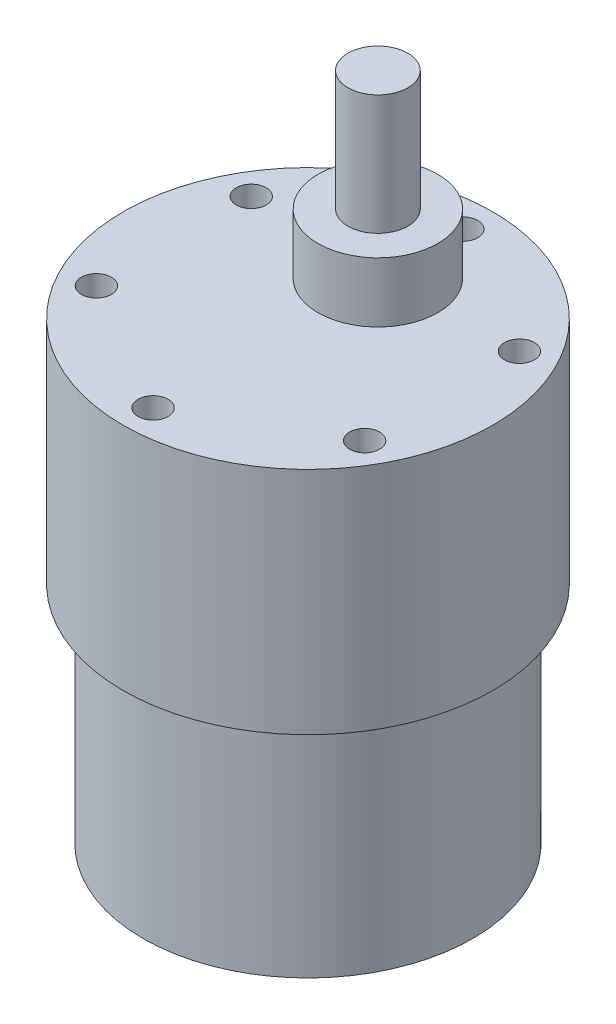
ISO-10303-21;
HEADER;
FILE_DESCRIPTION(('STEP AP214'),'2;1');
FILE_NAME('part.step','',(''),(''),'','','');
FILE_SCHEMA(('AUTOMOTIVE_DESIGN { 1 0 10303 214 1 1 1 1 }'));
ENDSEC;
DATA;
#1=APPLICATION_CONTEXT('core data for automotive mechanical design processes');
#2=APPLICATION_PROTOCOL_DEFINITION('international standard','automotive_design',2000,#1);
#3=PRODUCT_CONTEXT('',#1,'mechanical');
#4=PRODUCT('Part','Part','',(#3));
#5=PRODUCT_RELATED_PRODUCT_CATEGORY('part','',(#4));
#6=PRODUCT_DEFINITION_FORMATION('','',#4);
#7=PRODUCT_DEFINITION_CONTEXT('part definition',#1,'design');
#8=PRODUCT_DEFINITION('design','',#6,#7);
#9=PRODUCT_DEFINITION_SHAPE('','',#8);
#10=(LENGTH_UNIT() NAMED_UNIT(*) SI_UNIT(.MILLI.,.METRE.));
#11=(NAMED_UNIT(*) PLANE_ANGLE_UNIT() SI_UNIT($,.RADIAN.));
#12=(NAMED_UNIT(*) SI_UNIT($,.STERADIAN.) SOLID_ANGLE_UNIT());
#13=UNCERTAINTY_MEASURE_WITH_UNIT(LENGTH_MEASURE(1.E-05),#10,'distance_accuracy_value','');
#14=(GEOMETRIC_REPRESENTATION_CONTEXT(3) GLOBAL_UNCERTAINTY_ASSIGNED_CONTEXT((#13)) GLOBAL_UNIT_ASSIGNED_CONTEXT((#10,
#11,#12)) REPRESENTATION_CONTEXT('',''));
#15=CARTESIAN_POINT('',(0.,0.,0.));
#16=DIRECTION('',(0.,0.,1.));
#17=DIRECTION('',(1.,0.,0.));
#18=AXIS2_PLACEMENT_3D('',#15,#16,#17);
#19=CARTESIAN_POINT('',(0.,-23.,0.));
#20=DIRECTION('',(0.,1.,0.));
#21=DIRECTION('',(0.,0.,1.));
#22=AXIS2_PLACEMENT_3D('',#19,#20,#21);
#23=CYLINDRICAL_SURFACE('',#22,18.5);
#24=CARTESIAN_POINT('',(0.,-23.,0.));
#25=DIRECTION('',(0.,1.,0.));
#26=DIRECTION('',(0.,0.,1.));
#27=AXIS2_PLACEMENT_3D('',#24,#25,#26);
#28=CIRCLE('',#27,18.5);
#29=CARTESIAN_POINT('',(0.,-23.,18.5));
#30=VERTEX_POINT('',#29);
#31=EDGE_CURVE('E45',#30,#30,#28,.T.);
#32=ORIENTED_EDGE('',*,*,#31,.T.);
#33=EDGE_LOOP('',(#32));
#34=FACE_BOUND('',#33,.T.);
#35=CARTESIAN_POINT('',(0.,0.,0.));
#36=DIRECTION('',(0.,1.,0.));
#37=DIRECTION('',(0.,0.,1.));
#38=AXIS2_PLACEMENT_3D('',#35,#36,#37);
#39=CIRCLE('',#38,18.5);
#40=CARTESIAN_POINT('',(0.,0.,18.5));
#41=VERTEX_POINT('',#40);
#42=EDGE_CURVE('E36',#41,#41,#39,.T.);
#43=ORIENTED_EDGE('',*,*,#42,.F.);
#44=EDGE_LOOP('',(#43));
#45=FACE_BOUND('',#44,.T.);
#46=ADVANCED_FACE('F33',(#34,#45),#23,.T.);
#47=CARTESIAN_POINT('',(0.,-23.,0.));
#48=DIRECTION('',(0.,1.,0.));
#49=DIRECTION('',(0.,0.,1.));
#50=AXIS2_PLACEMENT_3D('',#47,#48,#49);
#51=PLANE('',#50);
#52=CARTESIAN_POINT('',(0.,-23.,0.));
#53=DIRECTION('',(0.,-1.,0.));
#54=DIRECTION('',(0.,0.,-1.));
#55=AXIS2_PLACEMENT_3D('',#52,#53,#54);
#56=CIRCLE('',#55,16.5);
#57=CARTESIAN_POINT('',(0.,-23.,16.5));
#58=VERTEX_POINT('',#57);
#59=EDGE_CURVE('E40',#58,#58,#56,.T.);
#60=ORIENTED_EDGE('',*,*,#59,.F.);
#61=EDGE_LOOP('',(#60));
#62=FACE_BOUND('',#61,.T.);
#63=ORIENTED_EDGE('',*,*,#31,.F.);
#64=EDGE_LOOP('',(#63));
#65=FACE_BOUND('',#64,.T.);
#66=ADVANCED_FACE('F103',(#62,#65),#51,.F.);
#67=CARTESIAN_POINT('',(0.,0.,0.));
#68=DIRECTION('',(0.,1.,0.));
#69=DIRECTION('',(0.,0.,1.));
#70=AXIS2_PLACEMENT_3D('',#67,#68,#69);
#71=PLANE('',#70);
#72=CARTESIAN_POINT('',(0.,0.,-7.));
#73=DIRECTION('',(0.,1.,0.));
#74=DIRECTION('',(0.,0.,1.));
#75=AXIS2_PLACEMENT_3D('',#72,#73,#74);
#76=CIRCLE('',#75,6.);
#77=CARTESIAN_POINT('',(0.,0.,-0.999999999999999));
#78=VERTEX_POINT('',#77);
#79=EDGE_CURVE('E54',#78,#78,#76,.T.);
#80=ORIENTED_EDGE('',*,*,#79,.F.);
#81=EDGE_LOOP('',(#80));
#82=FACE_BOUND('',#81,.T.);
#83=CARTESIAN_POINT('',(0.,0.,-15.5));
#84=DIRECTION('',(0.,1.,0.));
#85=DIRECTION('',(0.,0.,1.));
#86=AXIS2_PLACEMENT_3D('',#83,#84,#85);
#87=CIRCLE('',#86,1.5);
#88=CARTESIAN_POINT('',(0.,0.,-14.));
#89=VERTEX_POINT('',#88);
#90=EDGE_CURVE('E61',#89,#89,#87,.T.);
#91=ORIENTED_EDGE('',*,*,#90,.F.);
#92=EDGE_LOOP('',(#91));
#93=FACE_BOUND('',#92,.T.);
#94=CARTESIAN_POINT('',(-13.4233937586585,0.,-7.74999999999942));
#95=DIRECTION('',(0.,1.,0.));
#96=DIRECTION('',(0.,0.,1.));
#97=AXIS2_PLACEMENT_3D('',#94,#95,#96);
#98=CIRCLE('',#97,1.50000000000067);
#99=CARTESIAN_POINT('',(-13.4233937586585,0.,-6.24999999999875));
#100=VERTEX_POINT('',#99);
#101=EDGE_CURVE('E53',#100,#100,#98,.T.);
#102=ORIENTED_EDGE('',*,*,#101,.F.);
#103=EDGE_LOOP('',(#102));
#104=FACE_BOUND('',#103,.T.);
#105=CARTESIAN_POINT('',(-13.4233937586578,0.,7.75000000000058));
#106=DIRECTION('',(0.,1.,0.));
#107=DIRECTION('',(0.,0.,1.));
#108=AXIS2_PLACEMENT_3D('',#105,#106,#107);
#109=CIRCLE('',#108,1.50000000000126);
#110=CARTESIAN_POINT('',(-13.4233937586578,0.,9.25000000000183));
#111=VERTEX_POINT('',#110);
#112=EDGE_CURVE('E68',#111,#111,#109,.T.);
#113=ORIENTED_EDGE('',*,*,#112,.F.);
#114=EDGE_LOOP('',(#113));
#115=FACE_BOUND('',#114,.T.);
#116=CARTESIAN_POINT('',(1.31781308343643E-12,0.,15.5));
#117=DIRECTION('',(0.,1.,0.));
#118=DIRECTION('',(0.,0.,1.));
#119=AXIS2_PLACEMENT_3D('',#116,#117,#118);
#120=CIRCLE('',#119,1.50000000000136);
#121=CARTESIAN_POINT('',(1.31781308343643E-12,0.,17.0000000000014));
#122=VERTEX_POINT('',#121);
#123=EDGE_CURVE('E85',#122,#122,#120,.T.);
#124=ORIENTED_EDGE('',*,*,#123,.F.);
#125=EDGE_LOOP('',(#124));
#126=FACE_BOUND('',#125,.T.);
#127=CARTESIAN_POINT('',(13.4233937586598,0.,7.74999999999943));
#128=DIRECTION('',(0.,1.,0.));
#129=DIRECTION('',(0.,0.,1.));
#130=AXIS2_PLACEMENT_3D('',#127,#128,#129);
#131=CIRCLE('',#130,1.50000000000085);
#132=CARTESIAN_POINT('',(13.4233937586598,0.,9.25000000000028));
#133=VERTEX_POINT('',#132);
#134=EDGE_CURVE('E79',#133,#133,#131,.T.);
#135=ORIENTED_EDGE('',*,*,#134,.F.);
#136=EDGE_LOOP('',(#135));
#137=FACE_BOUND('',#136,.T.);
#138=CARTESIAN_POINT('',(13.4233937586591,0.,-7.75000000000057));
#139=DIRECTION('',(0.,1.,0.));
#140=DIRECTION('',(0.,0.,1.));
#141=AXIS2_PLACEMENT_3D('',#138,#139,#140);
#142=CIRCLE('',#141,1.50000000000019);
#143=CARTESIAN_POINT('',(13.4233937586591,0.,-6.25000000000039));
#144=VERTEX_POINT('',#143);
#145=EDGE_CURVE('E73',#144,#144,#142,.T.);
#146=ORIENTED_EDGE('',*,*,#145,.F.);
#147=EDGE_LOOP('',(#146));
#148=FACE_BOUND('',#147,.T.);
#149=ORIENTED_EDGE('',*,*,#42,.T.);
#150=EDGE_LOOP('',(#149));
#151=FACE_BOUND('',#150,.T.);
#152=ADVANCED_FACE('F100',(#82,#93,#104,#115,#126,#137,#148,#151),#71,.T.);
#153=CARTESIAN_POINT('',(0.,-45.5,0.));
#154=DIRECTION('',(0.,1.,0.));
#155=DIRECTION('',(0.,0.,1.));
#156=AXIS2_PLACEMENT_3D('',#153,#154,#155);
#157=CYLINDRICAL_SURFACE('',#156,16.5);
#158=CARTESIAN_POINT('',(0.,-45.5,0.));
#159=DIRECTION('',(0.,-1.,0.));
#160=DIRECTION('',(0.,0.,-1.));
#161=AXIS2_PLACEMENT_3D('',#158,#159,#160);
#162=CIRCLE('',#161,16.5);
#163=CARTESIAN_POINT('',(0.,-45.5,16.5));
#164=VERTEX_POINT('',#163);
#165=EDGE_CURVE('E60',#164,#164,#162,.T.);
#166=CARTESIAN_POINT('',(0.,-45.5,16.5));
#167=CARTESIAN_POINT('',(0.,-45.265625,16.5));
#168=CARTESIAN_POINT('',(0.,-45.03125,16.5));
#169=CARTESIAN_POINT('',(0.,-44.5625,16.5));
#170=CARTESIAN_POINT('',(0.,-44.328125,16.5));
#171=CARTESIAN_POINT('',(0.,-43.859375,16.5));
#172=CARTESIAN_POINT('',(0.,-43.625,16.5));
#173=CARTESIAN_POINT('',(0.,-43.15625,16.5));
#174=CARTESIAN_POINT('',(0.,-42.921875,16.5));
#175=CARTESIAN_POINT('',(0.,-42.453125,16.5));
#176=CARTESIAN_POINT('',(0.,-42.21875,16.5));
#177=CARTESIAN_POINT('',(0.,-41.75,16.5));
#178=CARTESIAN_POINT('',(0.,-41.515625,16.5));
#179=CARTESIAN_POINT('',(0.,-41.046875,16.5));
#180=CARTESIAN_POINT('',(0.,-40.8125,16.5));
#181=CARTESIAN_POINT('',(0.,-40.34375,16.5));
#182=CARTESIAN_POINT('',(0.,-40.109375,16.5));
#183=CARTESIAN_POINT('',(0.,-39.640625,16.5));
#184=CARTESIAN_POINT('',(0.,-39.40625,16.5));
#185=CARTESIAN_POINT('',(0.,-38.9375,16.5));
#186=CARTESIAN_POINT('',(0.,-38.703125,16.5));
#187=CARTESIAN_POINT('',(0.,-38.234375,16.5));
#188=CARTESIAN_POINT('',(0.,-38.,16.5));
#189=CARTESIAN_POINT('',(0.,-37.53125,16.5));
#190=CARTESIAN_POINT('',(0.,-37.296875,16.5));
#191=CARTESIAN_POINT('',(0.,-36.828125,16.5));
#192=CARTESIAN_POINT('',(0.,-36.59375,16.5));
#193=CARTESIAN_POINT('',(0.,-36.125,16.5));
#194=CARTESIAN_POINT('',(0.,-35.890625,16.5));
#195=CARTESIAN_POINT('',(0.,-35.421875,16.5));
#196=CARTESIAN_POINT('',(0.,-35.1875,16.5));
#197=CARTESIAN_POINT('',(0.,-34.71875,16.5));
#198=CARTESIAN_POINT('',(0.,-34.484375,16.5));
#199=CARTESIAN_POINT('',(0.,-34.015625,16.5));
#200=CARTESIAN_POINT('',(0.,-33.78125,16.5));
#201=CARTESIAN_POINT('',(0.,-33.3125,16.5));
#202=CARTESIAN_POINT('',(0.,-33.078125,16.5));
#203=CARTESIAN_POINT('',(0.,-32.609375,16.5));
#204=CARTESIAN_POINT('',(0.,-32.375,16.5));
#205=CARTESIAN_POINT('',(0.,-31.90625,16.5));
#206=CARTESIAN_POINT('',(0.,-31.671875,16.5));
#207=CARTESIAN_POINT('',(0.,-31.203125,16.5));
#208=CARTESIAN_POINT('',(0.,-30.96875,16.5));
#209=CARTESIAN_POINT('',(0.,-30.5,16.5));
#210=CARTESIAN_POINT('',(0.,-30.265625,16.5));
#211=CARTESIAN_POINT('',(0.,-29.796875,16.5));
#212=CARTESIAN_POINT('',(0.,-29.5625,16.5));
#213=CARTESIAN_POINT('',(0.,-29.09375,16.5));
#214=CARTESIAN_POINT('',(0.,-28.859375,16.5));
#215=CARTESIAN_POINT('',(0.,-28.390625,16.5));
#216=CARTESIAN_POINT('',(0.,-28.15625,16.5));
#217=CARTESIAN_POINT('',(0.,-27.6875,16.5));
#218=CARTESIAN_POINT('',(0.,-27.453125,16.5));
#219=CARTESIAN_POINT('',(0.,-26.984375,16.5));
#220=CARTESIAN_POINT('',(0.,-26.75,16.5));
#221=CARTESIAN_POINT('',(0.,-26.28125,16.5));
#222=CARTESIAN_POINT('',(0.,-26.046875,16.5));
#223=CARTESIAN_POINT('',(0.,-25.578125,16.5));
#224=CARTESIAN_POINT('',(0.,-25.34375,16.5));
#225=CARTESIAN_POINT('',(0.,-24.875,16.5));
#226=CARTESIAN_POINT('',(0.,-24.640625,16.5));
#227=CARTESIAN_POINT('',(0.,-24.171875,16.5));
#228=CARTESIAN_POINT('',(0.,-23.9375,16.5));
#229=CARTESIAN_POINT('',(0.,-23.46875,16.5));
#230=CARTESIAN_POINT('',(0.,-23.234375,16.5));
#231=CARTESIAN_POINT('',(0.,-23.,16.5));
#232=B_SPLINE_CURVE_WITH_KNOTS('',3,(#166,#167,#168,#169,#170,#171,#172,#173,#174,#175,#176,
#177,#178,#179,#180,#181,#182,#183,#184,#185,#186,#187,#188,#189,#190,#191,#192,#193,#194,#195,
#196,#197,#198,#199,#200,#201,#202,#203,#204,#205,#206,#207,#208,#209,#210,#211,#212,#213,#214,
#215,#216,#217,#218,#219,#220,#221,#222,#223,#224,#225,#226,#227,#228,#229,#230,#231),
.UNSPECIFIED.,.F.,.F.,(4,2,2,2,2,2,2,2,2,2,2,2,2,2,2,2,2,2,2,2,2,2,2,2,2,2,2,2,2,2,2,2,4),(0.,
0.703125000000006,1.40625,2.109375,2.8125,3.515625,4.21875,4.92187500000001,5.62500000000001,
6.328125,7.03125,7.734375,8.4375,9.140625,9.84375000000001,10.546875,11.25,11.953125,12.65625,
13.359375,14.0625,14.765625,15.46875,16.171875,16.875,17.578125,18.28125,18.984375,19.6875,
20.390625,21.09375,21.796875,22.5),.UNSPECIFIED.);
#233=EDGE_CURVE('BSEAM112',#164,#58,#232,.T.);
#234=ORIENTED_EDGE('',*,*,#165,.F.);
#235=ORIENTED_EDGE('',*,*,#59,.T.);
#236=ORIENTED_EDGE('',*,*,#233,.T.);
#237=ORIENTED_EDGE('',*,*,#233,.F.);
#238=EDGE_LOOP('',(#234,#236,#235,#237));
#239=FACE_BOUND('',#238,.T.);
#240=ADVANCED_FACE('F112',(#239),#157,.T.);
#241=CARTESIAN_POINT('',(0.,-45.5,0.));
#242=DIRECTION('',(0.,-1.,0.));
#243=DIRECTION('',(0.,0.,-1.));
#244=AXIS2_PLACEMENT_3D('',#241,#242,#243);
#245=PLANE('',#244);
#246=ORIENTED_EDGE('',*,*,#165,.T.);
#247=EDGE_LOOP('',(#246));
#248=FACE_BOUND('',#247,.T.);
#249=ADVANCED_FACE('F119',(#248),#245,.T.);
#250=CARTESIAN_POINT('',(13.4233937586591,-15.,-7.75000000000057));
#251=DIRECTION('',(0.,1.,0.));
#252=DIRECTION('',(0.,0.,1.));
#253=AXIS2_PLACEMENT_3D('',#250,#251,#252);
#254=CYLINDRICAL_SURFACE('',#253,1.50000000000019);
#255=CARTESIAN_POINT('',(13.4233937586591,-15.,-7.75000000000057));
#256=DIRECTION('',(0.,1.,0.));
#257=DIRECTION('',(0.,0.,1.));
#258=AXIS2_PLACEMENT_3D('',#255,#256,#257);
#259=CIRCLE('',#258,1.50000000000019);
#260=CARTESIAN_POINT('',(13.4233937586591,-15.,-6.25000000000039));
#261=VERTEX_POINT('',#260);
#262=EDGE_CURVE('E64',#261,#261,#259,.T.);
#263=ORIENTED_EDGE('',*,*,#262,.F.);
#264=EDGE_LOOP('',(#263));
#265=FACE_BOUND('',#264,.T.);
#266=ORIENTED_EDGE('',*,*,#145,.T.);
#267=EDGE_LOOP('',(#266));
#268=FACE_BOUND('',#267,.T.);
#269=ADVANCED_FACE('F123',(#265,#268),#254,.F.);
#270=CARTESIAN_POINT('',(13.4233937586591,-15.,-7.75000000000057));
#271=DIRECTION('',(0.,1.,0.));
#272=DIRECTION('',(0.,0.,1.));
#273=AXIS2_PLACEMENT_3D('',#270,#271,#272);
#274=PLANE('',#273);
#275=ORIENTED_EDGE('',*,*,#262,.T.);
#276=EDGE_LOOP('',(#275));
#277=FACE_BOUND('',#276,.T.);
#278=ADVANCED_FACE('F146',(#277),#274,.T.);
#279=CARTESIAN_POINT('',(13.4233937586598,-15.,7.74999999999943));
#280=DIRECTION('',(0.,1.,0.));
#281=DIRECTION('',(0.,0.,1.));
#282=AXIS2_PLACEMENT_3D('',#279,#280,#281);
#283=CYLINDRICAL_SURFACE('',#282,1.50000000000085);
#284=CARTESIAN_POINT('',(13.4233937586598,-15.,7.74999999999943));
#285=DIRECTION('',(0.,1.,0.));
#286=DIRECTION('',(0.,0.,1.));
#287=AXIS2_PLACEMENT_3D('',#284,#285,#286);
#288=CIRCLE('',#287,1.50000000000085);
#289=CARTESIAN_POINT('',(13.4233937586598,-15.,9.25000000000028));
#290=VERTEX_POINT('',#289);
#291=EDGE_CURVE('E76',#290,#290,#288,.T.);
#292=ORIENTED_EDGE('',*,*,#291,.F.);
#293=EDGE_LOOP('',(#292));
#294=FACE_BOUND('',#293,.T.);
#295=ORIENTED_EDGE('',*,*,#134,.T.);
#296=EDGE_LOOP('',(#295));
#297=FACE_BOUND('',#296,.T.);
#298=ADVANCED_FACE('F143',(#294,#297),#283,.F.);
#299=CARTESIAN_POINT('',(13.4233937586598,-15.,7.74999999999943));
#300=DIRECTION('',(0.,1.,0.));
#301=DIRECTION('',(0.,0.,1.));
#302=AXIS2_PLACEMENT_3D('',#299,#300,#301);
#303=PLANE('',#302);
#304=ORIENTED_EDGE('',*,*,#291,.T.);
#305=EDGE_LOOP('',(#304));
#306=FACE_BOUND('',#305,.T.);
#307=ADVANCED_FACE('F138',(#306),#303,.T.);
#308=CARTESIAN_POINT('',(1.31781308343643E-12,-15.,15.5));
#309=DIRECTION('',(0.,1.,0.));
#310=DIRECTION('',(0.,0.,1.));
#311=AXIS2_PLACEMENT_3D('',#308,#309,#310);
#312=CYLINDRICAL_SURFACE('',#311,1.50000000000136);
#313=CARTESIAN_POINT('',(1.31781308343643E-12,-15.,15.5));
#314=DIRECTION('',(0.,1.,0.));
#315=DIRECTION('',(0.,0.,1.));
#316=AXIS2_PLACEMENT_3D('',#313,#314,#315);
#317=CIRCLE('',#316,1.50000000000136);
#318=CARTESIAN_POINT('',(1.31781308343643E-12,-15.,17.0000000000014));
#319=VERTEX_POINT('',#318);
#320=EDGE_CURVE('E82',#319,#319,#317,.T.);
#321=ORIENTED_EDGE('',*,*,#320,.F.);
#322=EDGE_LOOP('',(#321));
#323=FACE_BOUND('',#322,.T.);
#324=ORIENTED_EDGE('',*,*,#123,.T.);
#325=EDGE_LOOP('',(#324));
#326=FACE_BOUND('',#325,.T.);
#327=ADVANCED_FACE('F135',(#323,#326),#312,.F.);
#328=CARTESIAN_POINT('',(1.31781308343643E-12,-15.,15.5));
#329=DIRECTION('',(0.,1.,0.));
#330=DIRECTION('',(0.,0.,1.));
#331=AXIS2_PLACEMENT_3D('',#328,#329,#330);
#332=PLANE('',#331);
#333=ORIENTED_EDGE('',*,*,#320,.T.);
#334=EDGE_LOOP('',(#333));
#335=FACE_BOUND('',#334,.T.);
#336=ADVANCED_FACE('F129',(#335),#332,.T.);
#337=CARTESIAN_POINT('',(-13.4233937586578,-15.,7.75000000000058));
#338=DIRECTION('',(0.,1.,0.));
#339=DIRECTION('',(0.,0.,1.));
#340=AXIS2_PLACEMENT_3D('',#337,#338,#339);
#341=CYLINDRICAL_SURFACE('',#340,1.50000000000126);
#342=CARTESIAN_POINT('',(-13.4233937586578,-15.,7.75000000000058));
#343=DIRECTION('',(0.,1.,0.));
#344=DIRECTION('',(0.,0.,1.));
#345=AXIS2_PLACEMENT_3D('',#342,#343,#344);
#346=CIRCLE('',#345,1.50000000000126);
#347=CARTESIAN_POINT('',(-13.4233937586578,-15.,9.25000000000183));
#348=VERTEX_POINT('',#347);
#349=EDGE_CURVE('E88',#348,#348,#346,.T.);
#350=ORIENTED_EDGE('',*,*,#349,.F.);
#351=EDGE_LOOP('',(#350));
#352=FACE_BOUND('',#351,.T.);
#353=ORIENTED_EDGE('',*,*,#112,.T.);
#354=EDGE_LOOP('',(#353));
#355=FACE_BOUND('',#354,.T.);
#356=ADVANCED_FACE('F125',(#352,#355),#341,.F.);
#357=CARTESIAN_POINT('',(-13.4233937586578,-15.,7.75000000000058));
#358=DIRECTION('',(0.,1.,0.));
#359=DIRECTION('',(0.,0.,1.));
#360=AXIS2_PLACEMENT_3D('',#357,#358,#359);
#361=PLANE('',#360);
#362=ORIENTED_EDGE('',*,*,#349,.T.);
#363=EDGE_LOOP('',(#362));
#364=FACE_BOUND('',#363,.T.);
#365=ADVANCED_FACE('F128',(#364),#361,.T.);
#366=CARTESIAN_POINT('',(-13.4233937586585,-15.,-7.74999999999942));
#367=DIRECTION('',(0.,1.,0.));
#368=DIRECTION('',(0.,0.,1.));
#369=AXIS2_PLACEMENT_3D('',#366,#367,#368);
#370=CYLINDRICAL_SURFACE('',#369,1.50000000000067);
#371=CARTESIAN_POINT('',(-13.4233937586585,-15.,-7.74999999999942));
#372=DIRECTION('',(0.,1.,0.));
#373=DIRECTION('',(0.,0.,1.));
#374=AXIS2_PLACEMENT_3D('',#371,#372,#373);
#375=CIRCLE('',#374,1.50000000000067);
#376=CARTESIAN_POINT('',(-13.4233937586585,-15.,-6.24999999999875));
#377=VERTEX_POINT('',#376);
#378=EDGE_CURVE('E65',#377,#377,#375,.T.);
#379=ORIENTED_EDGE('',*,*,#378,.F.);
#380=EDGE_LOOP('',(#379));
#381=FACE_BOUND('',#380,.T.);
#382=ORIENTED_EDGE('',*,*,#101,.T.);
#383=EDGE_LOOP('',(#382));
#384=FACE_BOUND('',#383,.T.);
#385=ADVANCED_FACE('F133',(#381,#384),#370,.F.);
#386=CARTESIAN_POINT('',(-13.4233937586585,-15.,-7.74999999999942));
#387=DIRECTION('',(0.,1.,0.));
#388=DIRECTION('',(0.,0.,1.));
#389=AXIS2_PLACEMENT_3D('',#386,#387,#388);
#390=PLANE('',#389);
#391=ORIENTED_EDGE('',*,*,#378,.T.);
#392=EDGE_LOOP('',(#391));
#393=FACE_BOUND('',#392,.T.);
#394=ADVANCED_FACE('F159',(#393),#390,.T.);
#395=CARTESIAN_POINT('',(0.,-15.,-15.5));
#396=DIRECTION('',(0.,1.,0.));
#397=DIRECTION('',(0.,0.,1.));
#398=AXIS2_PLACEMENT_3D('',#395,#396,#397);
#399=CYLINDRICAL_SURFACE('',#398,1.5);
#400=CARTESIAN_POINT('',(0.,-15.,-15.5));
#401=DIRECTION('',(0.,1.,0.));
#402=DIRECTION('',(0.,0.,1.));
#403=AXIS2_PLACEMENT_3D('',#400,#401,#402);
#404=CIRCLE('',#403,1.5);
#405=CARTESIAN_POINT('',(0.,-15.,-14.));
#406=VERTEX_POINT('',#405);
#407=EDGE_CURVE('E57',#406,#406,#404,.T.);
#408=ORIENTED_EDGE('',*,*,#407,.F.);
#409=EDGE_LOOP('',(#408));
#410=FACE_BOUND('',#409,.T.);
#411=ORIENTED_EDGE('',*,*,#90,.T.);
#412=EDGE_LOOP('',(#411));
#413=FACE_BOUND('',#412,.T.);
#414=ADVANCED_FACE('F163',(#410,#413),#399,.F.);
#415=CARTESIAN_POINT('',(0.,-15.,-15.5));
#416=DIRECTION('',(0.,1.,0.));
#417=DIRECTION('',(0.,0.,1.));
#418=AXIS2_PLACEMENT_3D('',#415,#416,#417);
#419=PLANE('',#418);
#420=ORIENTED_EDGE('',*,*,#407,.T.);
#421=EDGE_LOOP('',(#420));
#422=FACE_BOUND('',#421,.T.);
#423=ADVANCED_FACE('F167',(#422),#419,.T.);
#424=CARTESIAN_POINT('',(0.,6.,-7.));
#425=DIRECTION('',(0.,-1.,0.));
#426=DIRECTION('',(0.,0.,-1.));
#427=AXIS2_PLACEMENT_3D('',#424,#425,#426);
#428=CYLINDRICAL_SURFACE('',#427,6.);
#429=CARTESIAN_POINT('',(0.,6.,-7.));
#430=DIRECTION('',(0.,1.,0.));
#431=DIRECTION('',(0.,0.,1.));
#432=AXIS2_PLACEMENT_3D('',#429,#430,#431);
#433=CIRCLE('',#432,6.);
#434=CARTESIAN_POINT('',(0.,6.,-0.999999999999999));
#435=VERTEX_POINT('',#434);
#436=EDGE_CURVE('E50',#435,#435,#433,.T.);
#437=ORIENTED_EDGE('',*,*,#436,.F.);
#438=EDGE_LOOP('',(#437));
#439=FACE_BOUND('',#438,.T.);
#440=ORIENTED_EDGE('',*,*,#79,.T.);
#441=EDGE_LOOP('',(#440));
#442=FACE_BOUND('',#441,.T.);
#443=ADVANCED_FACE('F171',(#439,#442),#428,.T.);
#444=CARTESIAN_POINT('',(0.,6.,-7.));
#445=DIRECTION('',(0.,1.,0.));
#446=DIRECTION('',(0.,0.,1.));
#447=AXIS2_PLACEMENT_3D('',#444,#445,#446);
#448=PLANE('',#447);
#449=CARTESIAN_POINT('',(0.,6.,-7.));
#450=DIRECTION('',(0.,1.,0.));
#451=DIRECTION('',(0.,0.,1.));
#452=AXIS2_PLACEMENT_3D('',#449,#450,#451);
#453=CIRCLE('',#452,3.);
#454=CARTESIAN_POINT('',(0.,6.,-4.));
#455=VERTEX_POINT('',#454);
#456=EDGE_CURVE('E10',#455,#455,#453,.T.);
#457=ORIENTED_EDGE('',*,*,#456,.F.);
#458=EDGE_LOOP('',(#457));
#459=FACE_BOUND('',#458,.T.);
#460=ORIENTED_EDGE('',*,*,#436,.T.);
#461=EDGE_LOOP('',(#460));
#462=FACE_BOUND('',#461,.T.);
#463=ADVANCED_FACE('F175',(#459,#462),#448,.T.);
#464=CARTESIAN_POINT('',(0.,18.,-7.));
#465=DIRECTION('',(0.,-1.,0.));
#466=DIRECTION('',(0.,0.,-1.));
#467=AXIS2_PLACEMENT_3D('',#464,#465,#466);
#468=CYLINDRICAL_SURFACE('',#467,3.);
#469=CARTESIAN_POINT('',(0.,18.,-7.));
#470=DIRECTION('',(0.,1.,0.));
#471=DIRECTION('',(0.,0.,1.));
#472=AXIS2_PLACEMENT_3D('',#469,#470,#471);
#473=CIRCLE('',#472,3.);
#474=CARTESIAN_POINT('',(0.,18.,-4.));
#475=VERTEX_POINT('',#474);
#476=EDGE_CURVE('E49',#475,#475,#473,.T.);
#477=ORIENTED_EDGE('',*,*,#476,.F.);
#478=EDGE_LOOP('',(#477));
#479=FACE_BOUND('',#478,.T.);
#480=ORIENTED_EDGE('',*,*,#456,.T.);
#481=EDGE_LOOP('',(#480));
#482=FACE_BOUND('',#481,.T.);
#483=ADVANCED_FACE('F179',(#479,#482),#468,.T.);
#484=CARTESIAN_POINT('',(0.,18.,-7.));
#485=DIRECTION('',(0.,1.,0.));
#486=DIRECTION('',(0.,0.,1.));
#487=AXIS2_PLACEMENT_3D('',#484,#485,#486);
#488=PLANE('',#487);
#489=ORIENTED_EDGE('',*,*,#476,.T.);
#490=EDGE_LOOP('',(#489));
#491=FACE_BOUND('',#490,.T.);
#492=ADVANCED_FACE('F183',(#491),#488,.T.);
#493=CLOSED_SHELL('',(#46,#66,#152,#240,#249,#269,#278,#298,#307,#327,#336,#356,#365,#385,#394,
#414,#423,#443,#463,#483,#492));
#494=MANIFOLD_SOLID_BREP('B2',#493);
#495=ADVANCED_BREP_SHAPE_REPRESENTATION('',(#18,#494),#14);
#496=SHAPE_DEFINITION_REPRESENTATION(#9,#495);
ENDSEC;
END-ISO-10303-21;
